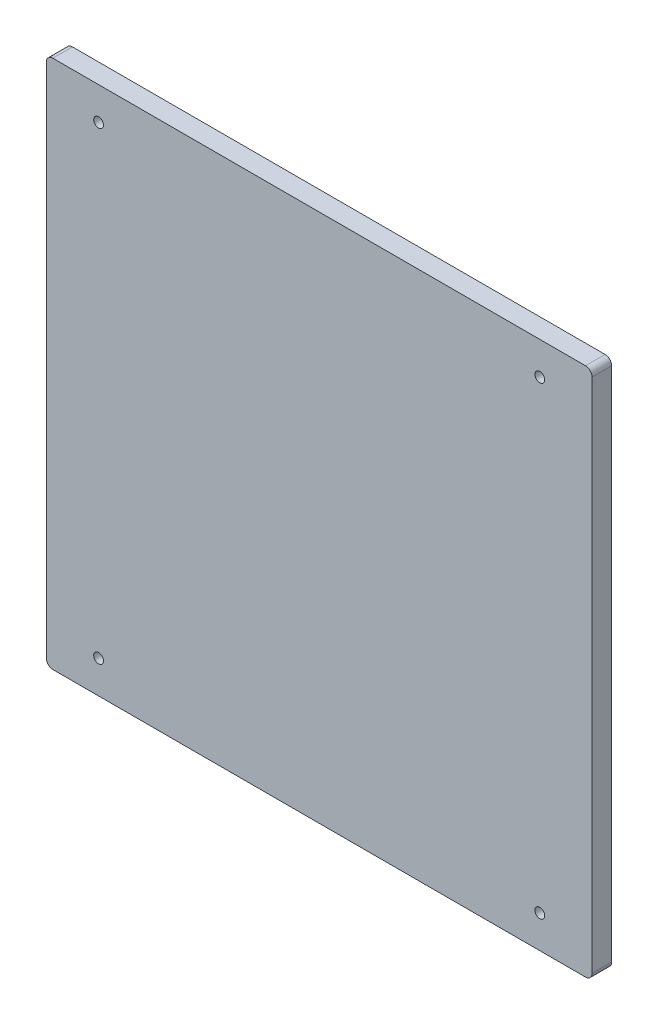
ISO-10303-21;
HEADER;
FILE_DESCRIPTION(('STEP AP214'),'2;1');
FILE_NAME('part.step','',(''),(''),'','','');
FILE_SCHEMA(('AUTOMOTIVE_DESIGN { 1 0 10303 214 1 1 1 1 }'));
ENDSEC;
DATA;
#1=APPLICATION_CONTEXT('core data for automotive mechanical design processes');
#2=APPLICATION_PROTOCOL_DEFINITION('international standard','automotive_design',2000,#1);
#3=PRODUCT_CONTEXT('',#1,'mechanical');
#4=PRODUCT('Part','Part','',(#3));
#5=PRODUCT_RELATED_PRODUCT_CATEGORY('part','',(#4));
#6=PRODUCT_DEFINITION_FORMATION('','',#4);
#7=PRODUCT_DEFINITION_CONTEXT('part definition',#1,'design');
#8=PRODUCT_DEFINITION('design','',#6,#7);
#9=PRODUCT_DEFINITION_SHAPE('','',#8);
#10=(LENGTH_UNIT() NAMED_UNIT(*) SI_UNIT(.MILLI.,.METRE.));
#11=(NAMED_UNIT(*) PLANE_ANGLE_UNIT() SI_UNIT($,.RADIAN.));
#12=(NAMED_UNIT(*) SI_UNIT($,.STERADIAN.) SOLID_ANGLE_UNIT());
#13=UNCERTAINTY_MEASURE_WITH_UNIT(LENGTH_MEASURE(1.E-05),#10,'distance_accuracy_value','');
#14=(GEOMETRIC_REPRESENTATION_CONTEXT(3) GLOBAL_UNCERTAINTY_ASSIGNED_CONTEXT((#13)) GLOBAL_UNIT_ASSIGNED_CONTEXT((#10,
#11,#12)) REPRESENTATION_CONTEXT('',''));
#15=CARTESIAN_POINT('',(0.,0.,0.));
#16=DIRECTION('',(0.,0.,1.));
#17=DIRECTION('',(1.,0.,0.));
#18=AXIS2_PLACEMENT_3D('',#15,#16,#17);
#19=CARTESIAN_POINT('',(81.5,-79.,6.));
#20=DIRECTION('',(0.,0.,1.));
#21=DIRECTION('',(1.,0.,0.));
#22=AXIS2_PLACEMENT_3D('',#19,#20,#21);
#23=PLANE('',#22);
#24=CARTESIAN_POINT('',(-67.5,71.,6.));
#25=DIRECTION('',(0.,0.,1.));
#26=DIRECTION('',(1.,0.,0.));
#27=AXIS2_PLACEMENT_3D('',#24,#25,#26);
#28=CIRCLE('',#27,1.5);
#29=CARTESIAN_POINT('',(-66.,71.,6.));
#30=VERTEX_POINT('',#29);
#31=EDGE_CURVE('E189',#30,#30,#28,.T.);
#32=ORIENTED_EDGE('',*,*,#31,.F.);
#33=EDGE_LOOP('',(#32));
#34=FACE_BOUND('',#33,.T.);
#35=CARTESIAN_POINT('',(-67.5,-71.,6.));
#36=DIRECTION('',(0.,0.,1.));
#37=DIRECTION('',(1.,0.,0.));
#38=AXIS2_PLACEMENT_3D('',#35,#36,#37);
#39=CIRCLE('',#38,1.50000000000001);
#40=CARTESIAN_POINT('',(-66.,-71.,6.));
#41=VERTEX_POINT('',#40);
#42=EDGE_CURVE('E135',#41,#41,#39,.T.);
#43=ORIENTED_EDGE('',*,*,#42,.F.);
#44=EDGE_LOOP('',(#43));
#45=FACE_BOUND('',#44,.T.);
#46=CARTESIAN_POINT('',(81.5,-79.,6.));
#47=DIRECTION('',(0.,0.,1.));
#48=DIRECTION('',(1.,0.,0.));
#49=AXIS2_PLACEMENT_3D('',#46,#47,#48);
#50=CIRCLE('',#49,2.);
#51=CARTESIAN_POINT('',(81.5,-81.,6.));
#52=VERTEX_POINT('',#51);
#53=CARTESIAN_POINT('',(83.5,-79.,6.));
#54=VERTEX_POINT('',#53);
#55=EDGE_CURVE('E146',#52,#54,#50,.T.);
#56=ORIENTED_EDGE('',*,*,#55,.T.);
#57=DIRECTION('',(0.,1.,0.));
#58=VECTOR('',#57,1.);
#59=CARTESIAN_POINT('',(83.5,-79.,6.));
#60=LINE('',#59,#58);
#61=CARTESIAN_POINT('',(83.5,79.,6.));
#62=VERTEX_POINT('',#61);
#63=EDGE_CURVE('E94',#54,#62,#60,.T.);
#64=ORIENTED_EDGE('',*,*,#63,.T.);
#65=CARTESIAN_POINT('',(81.5,79.,6.));
#66=DIRECTION('',(0.,0.,1.));
#67=DIRECTION('',(1.,0.,0.));
#68=AXIS2_PLACEMENT_3D('',#65,#66,#67);
#69=CIRCLE('',#68,2.);
#70=CARTESIAN_POINT('',(81.5,81.,6.));
#71=VERTEX_POINT('',#70);
#72=EDGE_CURVE('E161',#62,#71,#69,.T.);
#73=ORIENTED_EDGE('',*,*,#72,.T.);
#74=DIRECTION('',(-1.,0.,0.));
#75=VECTOR('',#74,1.);
#76=CARTESIAN_POINT('',(81.5,81.,6.));
#77=LINE('',#76,#75);
#78=CARTESIAN_POINT('',(-81.5,81.,6.));
#79=VERTEX_POINT('',#78);
#80=EDGE_CURVE('E174',#71,#79,#77,.T.);
#81=ORIENTED_EDGE('',*,*,#80,.T.);
#82=CARTESIAN_POINT('',(-81.5,79.,6.));
#83=DIRECTION('',(0.,0.,1.));
#84=DIRECTION('',(1.,0.,0.));
#85=AXIS2_PLACEMENT_3D('',#82,#83,#84);
#86=CIRCLE('',#85,2.00000000000001);
#87=CARTESIAN_POINT('',(-83.5,79.,6.));
#88=VERTEX_POINT('',#87);
#89=EDGE_CURVE('E113',#79,#88,#86,.T.);
#90=ORIENTED_EDGE('',*,*,#89,.T.);
#91=DIRECTION('',(0.,-1.,0.));
#92=VECTOR('',#91,1.);
#93=CARTESIAN_POINT('',(-83.5,-79.,6.));
#94=LINE('',#93,#92);
#95=CARTESIAN_POINT('',(-83.5,-79.,6.));
#96=VERTEX_POINT('',#95);
#97=EDGE_CURVE('E107',#88,#96,#94,.T.);
#98=ORIENTED_EDGE('',*,*,#97,.T.);
#99=CARTESIAN_POINT('',(-81.5,-79.,6.));
#100=DIRECTION('',(0.,0.,1.));
#101=DIRECTION('',(-1.,0.,0.));
#102=AXIS2_PLACEMENT_3D('',#99,#100,#101);
#103=CIRCLE('',#102,1.99999999999999);
#104=CARTESIAN_POINT('',(-81.5,-81.,6.));
#105=VERTEX_POINT('',#104);
#106=EDGE_CURVE('E111',#96,#105,#103,.T.);
#107=ORIENTED_EDGE('',*,*,#106,.T.);
#108=DIRECTION('',(1.,0.,0.));
#109=VECTOR('',#108,1.);
#110=CARTESIAN_POINT('',(81.5,-81.,6.));
#111=LINE('',#110,#109);
#112=EDGE_CURVE('E51',#105,#52,#111,.T.);
#113=ORIENTED_EDGE('',*,*,#112,.T.);
#114=EDGE_LOOP('',(#56,#64,#73,#81,#90,#98,#107,#113));
#115=FACE_BOUND('',#114,.T.);
#116=CARTESIAN_POINT('',(67.5,71.,6.));
#117=DIRECTION('',(0.,0.,1.));
#118=DIRECTION('',(1.,0.,0.));
#119=AXIS2_PLACEMENT_3D('',#116,#117,#118);
#120=CIRCLE('',#119,1.5);
#121=CARTESIAN_POINT('',(69.,71.,6.));
#122=VERTEX_POINT('',#121);
#123=EDGE_CURVE('E183',#122,#122,#120,.T.);
#124=ORIENTED_EDGE('',*,*,#123,.F.);
#125=EDGE_LOOP('',(#124));
#126=FACE_BOUND('',#125,.T.);
#127=CARTESIAN_POINT('',(67.5,-71.,6.));
#128=DIRECTION('',(0.,0.,1.));
#129=DIRECTION('',(1.,0.,0.));
#130=AXIS2_PLACEMENT_3D('',#127,#128,#129);
#131=CIRCLE('',#130,1.5);
#132=CARTESIAN_POINT('',(69.,-71.,6.));
#133=VERTEX_POINT('',#132);
#134=EDGE_CURVE('E195',#133,#133,#131,.T.);
#135=ORIENTED_EDGE('',*,*,#134,.F.);
#136=EDGE_LOOP('',(#135));
#137=FACE_BOUND('',#136,.T.);
#138=ADVANCED_FACE('F34',(#34,#45,#115,#126,#137),#23,.T.);
#139=CARTESIAN_POINT('',(81.5,-79.,0.));
#140=DIRECTION('',(0.,0.,1.));
#141=DIRECTION('',(1.,0.,0.));
#142=AXIS2_PLACEMENT_3D('',#139,#140,#141);
#143=PLANE('',#142);
#144=CARTESIAN_POINT('',(81.5,-79.,0.));
#145=DIRECTION('',(0.,0.,1.));
#146=DIRECTION('',(1.,0.,0.));
#147=AXIS2_PLACEMENT_3D('',#144,#145,#146);
#148=CIRCLE('',#147,2.);
#149=CARTESIAN_POINT('',(81.5,-81.,0.));
#150=VERTEX_POINT('',#149);
#151=CARTESIAN_POINT('',(83.5,-79.,0.));
#152=VERTEX_POINT('',#151);
#153=EDGE_CURVE('E131',#150,#152,#148,.T.);
#154=ORIENTED_EDGE('',*,*,#153,.F.);
#155=DIRECTION('',(1.,0.,0.));
#156=VECTOR('',#155,1.);
#157=CARTESIAN_POINT('',(81.5,-81.,0.));
#158=LINE('',#157,#156);
#159=CARTESIAN_POINT('',(-81.5,-81.,0.));
#160=VERTEX_POINT('',#159);
#161=EDGE_CURVE('E86',#160,#150,#158,.T.);
#162=ORIENTED_EDGE('',*,*,#161,.F.);
#163=CARTESIAN_POINT('',(-81.5,-79.,0.));
#164=DIRECTION('',(0.,0.,1.));
#165=DIRECTION('',(-1.,0.,0.));
#166=AXIS2_PLACEMENT_3D('',#163,#164,#165);
#167=CIRCLE('',#166,1.99999999999999);
#168=CARTESIAN_POINT('',(-83.5,-79.,0.));
#169=VERTEX_POINT('',#168);
#170=EDGE_CURVE('E80',#169,#160,#167,.T.);
#171=ORIENTED_EDGE('',*,*,#170,.F.);
#172=DIRECTION('',(0.,-1.,0.));
#173=VECTOR('',#172,1.);
#174=CARTESIAN_POINT('',(-83.5,-79.,0.));
#175=LINE('',#174,#173);
#176=CARTESIAN_POINT('',(-83.5,79.,0.));
#177=VERTEX_POINT('',#176);
#178=EDGE_CURVE('E121',#177,#169,#175,.T.);
#179=ORIENTED_EDGE('',*,*,#178,.F.);
#180=CARTESIAN_POINT('',(-81.5,79.,0.));
#181=DIRECTION('',(0.,0.,1.));
#182=DIRECTION('',(1.,0.,0.));
#183=AXIS2_PLACEMENT_3D('',#180,#181,#182);
#184=CIRCLE('',#183,2.00000000000001);
#185=CARTESIAN_POINT('',(-81.5,81.,0.));
#186=VERTEX_POINT('',#185);
#187=EDGE_CURVE('E141',#186,#177,#184,.T.);
#188=ORIENTED_EDGE('',*,*,#187,.F.);
#189=DIRECTION('',(-1.,0.,0.));
#190=VECTOR('',#189,1.);
#191=CARTESIAN_POINT('',(81.5,81.,0.));
#192=LINE('',#191,#190);
#193=CARTESIAN_POINT('',(81.5,81.,0.));
#194=VERTEX_POINT('',#193);
#195=EDGE_CURVE('E139',#194,#186,#192,.T.);
#196=ORIENTED_EDGE('',*,*,#195,.F.);
#197=CARTESIAN_POINT('',(81.5,79.,0.));
#198=DIRECTION('',(0.,0.,1.));
#199=DIRECTION('',(1.,0.,0.));
#200=AXIS2_PLACEMENT_3D('',#197,#198,#199);
#201=CIRCLE('',#200,2.);
#202=CARTESIAN_POINT('',(83.5,79.,0.));
#203=VERTEX_POINT('',#202);
#204=EDGE_CURVE('E137',#203,#194,#201,.T.);
#205=ORIENTED_EDGE('',*,*,#204,.F.);
#206=DIRECTION('',(0.,1.,0.));
#207=VECTOR('',#206,1.);
#208=CARTESIAN_POINT('',(83.5,-79.,0.));
#209=LINE('',#208,#207);
#210=EDGE_CURVE('E134',#152,#203,#209,.T.);
#211=ORIENTED_EDGE('',*,*,#210,.F.);
#212=EDGE_LOOP('',(#154,#162,#171,#179,#188,#196,#205,#211));
#213=FACE_BOUND('',#212,.T.);
#214=CARTESIAN_POINT('',(-67.5,-71.,0.));
#215=DIRECTION('',(0.,0.,1.));
#216=DIRECTION('',(1.,0.,0.));
#217=AXIS2_PLACEMENT_3D('',#214,#215,#216);
#218=CIRCLE('',#217,1.50000000000001);
#219=CARTESIAN_POINT('',(-66.,-71.,0.));
#220=VERTEX_POINT('',#219);
#221=EDGE_CURVE('E180',#220,#220,#218,.T.);
#222=ORIENTED_EDGE('',*,*,#221,.T.);
#223=EDGE_LOOP('',(#222));
#224=FACE_BOUND('',#223,.T.);
#225=CARTESIAN_POINT('',(67.5,71.,0.));
#226=DIRECTION('',(0.,0.,1.));
#227=DIRECTION('',(1.,0.,0.));
#228=AXIS2_PLACEMENT_3D('',#225,#226,#227);
#229=CIRCLE('',#228,1.5);
#230=CARTESIAN_POINT('',(69.,71.,0.));
#231=VERTEX_POINT('',#230);
#232=EDGE_CURVE('E186',#231,#231,#229,.T.);
#233=ORIENTED_EDGE('',*,*,#232,.T.);
#234=EDGE_LOOP('',(#233));
#235=FACE_BOUND('',#234,.T.);
#236=CARTESIAN_POINT('',(-67.5,71.,0.));
#237=DIRECTION('',(0.,0.,1.));
#238=DIRECTION('',(1.,0.,0.));
#239=AXIS2_PLACEMENT_3D('',#236,#237,#238);
#240=CIRCLE('',#239,1.5);
#241=CARTESIAN_POINT('',(-66.,71.,0.));
#242=VERTEX_POINT('',#241);
#243=EDGE_CURVE('E192',#242,#242,#240,.T.);
#244=ORIENTED_EDGE('',*,*,#243,.T.);
#245=EDGE_LOOP('',(#244));
#246=FACE_BOUND('',#245,.T.);
#247=CARTESIAN_POINT('',(67.5,-71.,0.));
#248=DIRECTION('',(0.,0.,1.));
#249=DIRECTION('',(1.,0.,0.));
#250=AXIS2_PLACEMENT_3D('',#247,#248,#249);
#251=CIRCLE('',#250,1.5);
#252=CARTESIAN_POINT('',(69.,-71.,0.));
#253=VERTEX_POINT('',#252);
#254=EDGE_CURVE('E198',#253,#253,#251,.T.);
#255=ORIENTED_EDGE('',*,*,#254,.T.);
#256=EDGE_LOOP('',(#255));
#257=FACE_BOUND('',#256,.T.);
#258=ADVANCED_FACE('F165',(#213,#224,#235,#246,#257),#143,.F.);
#259=CARTESIAN_POINT('',(81.5,-79.,6.));
#260=DIRECTION('',(0.,0.,-1.));
#261=DIRECTION('',(-1.,0.,0.));
#262=AXIS2_PLACEMENT_3D('',#259,#260,#261);
#263=CYLINDRICAL_SURFACE('',#262,2.);
#264=ORIENTED_EDGE('',*,*,#153,.T.);
#265=DIRECTION('',(0.,0.,-1.));
#266=VECTOR('',#265,1.);
#267=CARTESIAN_POINT('',(83.5,-79.,6.));
#268=LINE('',#267,#266);
#269=EDGE_CURVE('E11',#54,#152,#268,.T.);
#270=ORIENTED_EDGE('',*,*,#269,.F.);
#271=ORIENTED_EDGE('',*,*,#55,.F.);
#272=DIRECTION('',(0.,0.,-1.));
#273=VECTOR('',#272,1.);
#274=CARTESIAN_POINT('',(81.5,-81.,6.));
#275=LINE('',#274,#273);
#276=EDGE_CURVE('E127',#52,#150,#275,.T.);
#277=ORIENTED_EDGE('',*,*,#276,.T.);
#278=EDGE_LOOP('',(#264,#270,#271,#277));
#279=FACE_BOUND('',#278,.T.);
#280=ADVANCED_FACE('F36',(#279),#263,.T.);
#281=CARTESIAN_POINT('',(83.5,-79.,6.));
#282=DIRECTION('',(-1.,0.,0.));
#283=DIRECTION('',(0.,0.,1.));
#284=AXIS2_PLACEMENT_3D('',#281,#282,#283);
#285=PLANE('',#284);
#286=ORIENTED_EDGE('',*,*,#210,.T.);
#287=DIRECTION('',(0.,0.,-1.));
#288=VECTOR('',#287,1.);
#289=CARTESIAN_POINT('',(83.5,79.,6.));
#290=LINE('',#289,#288);
#291=EDGE_CURVE('E43',#62,#203,#290,.T.);
#292=ORIENTED_EDGE('',*,*,#291,.F.);
#293=ORIENTED_EDGE('',*,*,#63,.F.);
#294=ORIENTED_EDGE('',*,*,#269,.T.);
#295=EDGE_LOOP('',(#286,#292,#293,#294));
#296=FACE_BOUND('',#295,.T.);
#297=ADVANCED_FACE('F232',(#296),#285,.F.);
#298=CARTESIAN_POINT('',(81.5,79.,6.));
#299=DIRECTION('',(0.,0.,-1.));
#300=DIRECTION('',(-1.,0.,0.));
#301=AXIS2_PLACEMENT_3D('',#298,#299,#300);
#302=CYLINDRICAL_SURFACE('',#301,2.);
#303=ORIENTED_EDGE('',*,*,#204,.T.);
#304=DIRECTION('',(0.,0.,-1.));
#305=VECTOR('',#304,1.);
#306=CARTESIAN_POINT('',(81.5,81.,6.));
#307=LINE('',#306,#305);
#308=EDGE_CURVE('E153',#71,#194,#307,.T.);
#309=ORIENTED_EDGE('',*,*,#308,.F.);
#310=ORIENTED_EDGE('',*,*,#72,.F.);
#311=ORIENTED_EDGE('',*,*,#291,.T.);
#312=EDGE_LOOP('',(#303,#309,#310,#311));
#313=FACE_BOUND('',#312,.T.);
#314=ADVANCED_FACE('F159',(#313),#302,.T.);
#315=CARTESIAN_POINT('',(81.5,81.,6.));
#316=DIRECTION('',(0.,-1.,0.));
#317=DIRECTION('',(1.,0.,0.));
#318=AXIS2_PLACEMENT_3D('',#315,#316,#317);
#319=PLANE('',#318);
#320=ORIENTED_EDGE('',*,*,#195,.T.);
#321=DIRECTION('',(0.,0.,-1.));
#322=VECTOR('',#321,1.);
#323=CARTESIAN_POINT('',(-81.5,81.,6.));
#324=LINE('',#323,#322);
#325=EDGE_CURVE('E150',#79,#186,#324,.T.);
#326=ORIENTED_EDGE('',*,*,#325,.F.);
#327=ORIENTED_EDGE('',*,*,#80,.F.);
#328=ORIENTED_EDGE('',*,*,#308,.T.);
#329=EDGE_LOOP('',(#320,#326,#327,#328));
#330=FACE_BOUND('',#329,.T.);
#331=ADVANCED_FACE('F170',(#330),#319,.F.);
#332=CARTESIAN_POINT('',(-81.5,79.,6.));
#333=DIRECTION('',(0.,0.,-1.));
#334=DIRECTION('',(-1.,0.,0.));
#335=AXIS2_PLACEMENT_3D('',#332,#333,#334);
#336=CYLINDRICAL_SURFACE('',#335,2.00000000000001);
#337=ORIENTED_EDGE('',*,*,#187,.T.);
#338=DIRECTION('',(0.,0.,-1.));
#339=VECTOR('',#338,1.);
#340=CARTESIAN_POINT('',(-83.5,79.,6.));
#341=LINE('',#340,#339);
#342=EDGE_CURVE('E122',#88,#177,#341,.T.);
#343=ORIENTED_EDGE('',*,*,#342,.F.);
#344=ORIENTED_EDGE('',*,*,#89,.F.);
#345=ORIENTED_EDGE('',*,*,#325,.T.);
#346=EDGE_LOOP('',(#337,#343,#344,#345));
#347=FACE_BOUND('',#346,.T.);
#348=ADVANCED_FACE('F173',(#347),#336,.T.);
#349=CARTESIAN_POINT('',(-83.5,-79.,6.));
#350=DIRECTION('',(1.,0.,0.));
#351=DIRECTION('',(0.,0.,-1.));
#352=AXIS2_PLACEMENT_3D('',#349,#350,#351);
#353=PLANE('',#352);
#354=ORIENTED_EDGE('',*,*,#178,.T.);
#355=DIRECTION('',(0.,0.,-1.));
#356=VECTOR('',#355,1.);
#357=CARTESIAN_POINT('',(-83.5,-79.,6.));
#358=LINE('',#357,#356);
#359=EDGE_CURVE('E118',#96,#169,#358,.T.);
#360=ORIENTED_EDGE('',*,*,#359,.F.);
#361=ORIENTED_EDGE('',*,*,#97,.F.);
#362=ORIENTED_EDGE('',*,*,#342,.T.);
#363=EDGE_LOOP('',(#354,#360,#361,#362));
#364=FACE_BOUND('',#363,.T.);
#365=ADVANCED_FACE('F119',(#364),#353,.F.);
#366=CARTESIAN_POINT('',(-81.5,-79.,6.));
#367=DIRECTION('',(0.,0.,-1.));
#368=DIRECTION('',(-1.,0.,0.));
#369=AXIS2_PLACEMENT_3D('',#366,#367,#368);
#370=CYLINDRICAL_SURFACE('',#369,1.99999999999999);
#371=ORIENTED_EDGE('',*,*,#170,.T.);
#372=DIRECTION('',(0.,0.,-1.));
#373=VECTOR('',#372,1.);
#374=CARTESIAN_POINT('',(-81.5,-81.,6.));
#375=LINE('',#374,#373);
#376=EDGE_CURVE('E123',#105,#160,#375,.T.);
#377=ORIENTED_EDGE('',*,*,#376,.F.);
#378=ORIENTED_EDGE('',*,*,#106,.F.);
#379=ORIENTED_EDGE('',*,*,#359,.T.);
#380=EDGE_LOOP('',(#371,#377,#378,#379));
#381=FACE_BOUND('',#380,.T.);
#382=ADVANCED_FACE('F125',(#381),#370,.T.);
#383=CARTESIAN_POINT('',(81.5,-81.,6.));
#384=DIRECTION('',(0.,1.,0.));
#385=DIRECTION('',(-1.,0.,0.));
#386=AXIS2_PLACEMENT_3D('',#383,#384,#385);
#387=PLANE('',#386);
#388=ORIENTED_EDGE('',*,*,#161,.T.);
#389=ORIENTED_EDGE('',*,*,#276,.F.);
#390=ORIENTED_EDGE('',*,*,#112,.F.);
#391=ORIENTED_EDGE('',*,*,#376,.T.);
#392=EDGE_LOOP('',(#388,#389,#390,#391));
#393=FACE_BOUND('',#392,.T.);
#394=ADVANCED_FACE('F220',(#393),#387,.F.);
#395=CARTESIAN_POINT('',(-67.5,-71.,6.));
#396=DIRECTION('',(0.,0.,-1.));
#397=DIRECTION('',(-1.,0.,0.));
#398=AXIS2_PLACEMENT_3D('',#395,#396,#397);
#399=CYLINDRICAL_SURFACE('',#398,1.50000000000001);
#400=ORIENTED_EDGE('',*,*,#42,.T.);
#401=EDGE_LOOP('',(#400));
#402=FACE_BOUND('',#401,.T.);
#403=ORIENTED_EDGE('',*,*,#221,.F.);
#404=EDGE_LOOP('',(#403));
#405=FACE_BOUND('',#404,.T.);
#406=ADVANCED_FACE('F217',(#402,#405),#399,.F.);
#407=CARTESIAN_POINT('',(67.5,71.,6.));
#408=DIRECTION('',(0.,0.,-1.));
#409=DIRECTION('',(-1.,0.,0.));
#410=AXIS2_PLACEMENT_3D('',#407,#408,#409);
#411=CYLINDRICAL_SURFACE('',#410,1.5);
#412=ORIENTED_EDGE('',*,*,#123,.T.);
#413=EDGE_LOOP('',(#412));
#414=FACE_BOUND('',#413,.T.);
#415=ORIENTED_EDGE('',*,*,#232,.F.);
#416=EDGE_LOOP('',(#415));
#417=FACE_BOUND('',#416,.T.);
#418=ADVANCED_FACE('F296',(#414,#417),#411,.F.);
#419=CARTESIAN_POINT('',(-67.5,71.,6.));
#420=DIRECTION('',(0.,0.,-1.));
#421=DIRECTION('',(-1.,0.,0.));
#422=AXIS2_PLACEMENT_3D('',#419,#420,#421);
#423=CYLINDRICAL_SURFACE('',#422,1.5);
#424=ORIENTED_EDGE('',*,*,#31,.T.);
#425=EDGE_LOOP('',(#424));
#426=FACE_BOUND('',#425,.T.);
#427=ORIENTED_EDGE('',*,*,#243,.F.);
#428=EDGE_LOOP('',(#427));
#429=FACE_BOUND('',#428,.T.);
#430=ADVANCED_FACE('F304',(#426,#429),#423,.F.);
#431=CARTESIAN_POINT('',(67.5,-71.,6.));
#432=DIRECTION('',(0.,0.,-1.));
#433=DIRECTION('',(-1.,0.,0.));
#434=AXIS2_PLACEMENT_3D('',#431,#432,#433);
#435=CYLINDRICAL_SURFACE('',#434,1.5);
#436=ORIENTED_EDGE('',*,*,#134,.T.);
#437=EDGE_LOOP('',(#436));
#438=FACE_BOUND('',#437,.T.);
#439=ORIENTED_EDGE('',*,*,#254,.F.);
#440=EDGE_LOOP('',(#439));
#441=FACE_BOUND('',#440,.T.);
#442=ADVANCED_FACE('F204',(#438,#441),#435,.F.);
#443=CLOSED_SHELL('',(#138,#258,#280,#297,#314,#331,#348,#365,#382,#394,#406,#418,#430,#442));
#444=MANIFOLD_SOLID_BREP('B2',#443);
#445=ADVANCED_BREP_SHAPE_REPRESENTATION('',(#18,#444),#14);
#446=SHAPE_DEFINITION_REPRESENTATION(#9,#445);
ENDSEC;
END-ISO-10303-21;
